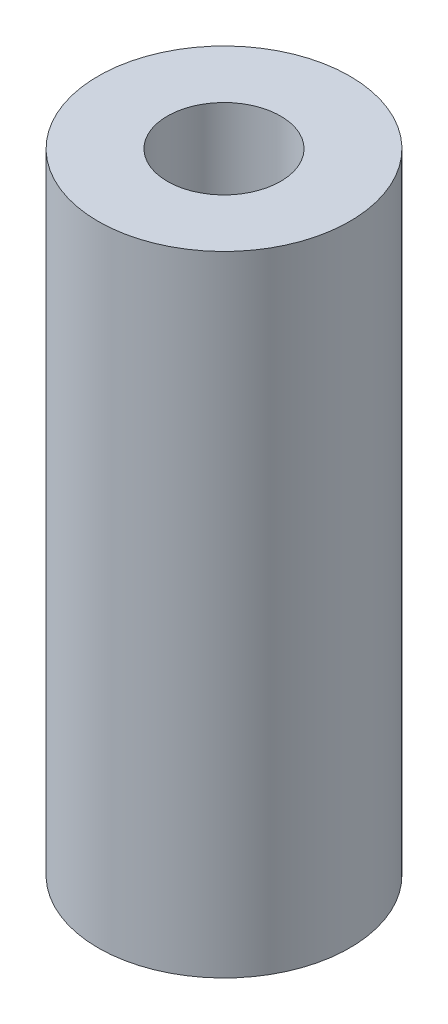
ISO-10303-21;
HEADER;
FILE_DESCRIPTION(('STEP AP214'),'2;1');
FILE_NAME('part.step','',(''),(''),'','','');
FILE_SCHEMA(('AUTOMOTIVE_DESIGN { 1 0 10303 214 1 1 1 1 }'));
ENDSEC;
DATA;
#1=APPLICATION_CONTEXT('core data for automotive mechanical design processes');
#2=APPLICATION_PROTOCOL_DEFINITION('international standard','automotive_design',2000,#1);
#3=PRODUCT_CONTEXT('',#1,'mechanical');
#4=PRODUCT('Part','Part','',(#3));
#5=PRODUCT_RELATED_PRODUCT_CATEGORY('part','',(#4));
#6=PRODUCT_DEFINITION_FORMATION('','',#4);
#7=PRODUCT_DEFINITION_CONTEXT('part definition',#1,'design');
#8=PRODUCT_DEFINITION('design','',#6,#7);
#9=PRODUCT_DEFINITION_SHAPE('','',#8);
#10=(LENGTH_UNIT() NAMED_UNIT(*) SI_UNIT(.MILLI.,.METRE.));
#11=(NAMED_UNIT(*) PLANE_ANGLE_UNIT() SI_UNIT($,.RADIAN.));
#12=(NAMED_UNIT(*) SI_UNIT($,.STERADIAN.) SOLID_ANGLE_UNIT());
#13=UNCERTAINTY_MEASURE_WITH_UNIT(LENGTH_MEASURE(1.E-05),#10,'distance_accuracy_value','');
#14=(GEOMETRIC_REPRESENTATION_CONTEXT(3) GLOBAL_UNCERTAINTY_ASSIGNED_CONTEXT((#13)) GLOBAL_UNIT_ASSIGNED_CONTEXT((#10,
#11,#12)) REPRESENTATION_CONTEXT('',''));
#15=CARTESIAN_POINT('',(0.,0.,0.));
#16=DIRECTION('',(0.,0.,1.));
#17=DIRECTION('',(1.,0.,0.));
#18=AXIS2_PLACEMENT_3D('',#15,#16,#17);
#19=CARTESIAN_POINT('',(0.,20.,0.));
#20=DIRECTION('',(0.,1.,0.));
#21=DIRECTION('',(0.,0.,1.));
#22=AXIS2_PLACEMENT_3D('',#19,#20,#21);
#23=PLANE('',#22);
#24=CARTESIAN_POINT('',(0.,20.,0.));
#25=DIRECTION('',(0.,1.,0.));
#26=DIRECTION('',(0.,0.,1.));
#27=AXIS2_PLACEMENT_3D('',#24,#25,#26);
#28=CIRCLE('',#27,4.);
#29=CARTESIAN_POINT('',(0.,20.,4.));
#30=VERTEX_POINT('',#29);
#31=EDGE_CURVE('E10',#30,#30,#28,.T.);
#32=ORIENTED_EDGE('',*,*,#31,.T.);
#33=EDGE_LOOP('',(#32));
#34=FACE_BOUND('',#33,.T.);
#35=CARTESIAN_POINT('',(0.,20.,0.));
#36=DIRECTION('',(0.,1.,0.));
#37=DIRECTION('',(0.,0.,1.));
#38=AXIS2_PLACEMENT_3D('',#35,#36,#37);
#39=CIRCLE('',#38,1.8);
#40=CARTESIAN_POINT('',(0.,20.,1.8));
#41=VERTEX_POINT('',#40);
#42=EDGE_CURVE('E50',#41,#41,#39,.T.);
#43=ORIENTED_EDGE('',*,*,#42,.F.);
#44=EDGE_LOOP('',(#43));
#45=FACE_BOUND('',#44,.T.);
#46=ADVANCED_FACE('F37',(#34,#45),#23,.T.);
#47=CARTESIAN_POINT('',(0.,0.,0.));
#48=DIRECTION('',(0.,1.,0.));
#49=DIRECTION('',(0.,0.,1.));
#50=AXIS2_PLACEMENT_3D('',#47,#48,#49);
#51=PLANE('',#50);
#52=CARTESIAN_POINT('',(0.,0.,0.));
#53=DIRECTION('',(0.,1.,0.));
#54=DIRECTION('',(0.,0.,1.));
#55=AXIS2_PLACEMENT_3D('',#52,#53,#54);
#56=CIRCLE('',#55,4.);
#57=CARTESIAN_POINT('',(0.,0.,4.));
#58=VERTEX_POINT('',#57);
#59=EDGE_CURVE('E41',#58,#58,#56,.T.);
#60=ORIENTED_EDGE('',*,*,#59,.F.);
#61=EDGE_LOOP('',(#60));
#62=FACE_BOUND('',#61,.T.);
#63=CARTESIAN_POINT('',(0.,0.,0.));
#64=DIRECTION('',(0.,1.,0.));
#65=DIRECTION('',(0.,0.,1.));
#66=AXIS2_PLACEMENT_3D('',#63,#64,#65);
#67=CIRCLE('',#66,1.8);
#68=CARTESIAN_POINT('',(0.,0.,1.8));
#69=VERTEX_POINT('',#68);
#70=EDGE_CURVE('E52',#69,#69,#67,.T.);
#71=ORIENTED_EDGE('',*,*,#70,.T.);
#72=EDGE_LOOP('',(#71));
#73=FACE_BOUND('',#72,.T.);
#74=ADVANCED_FACE('F64',(#62,#73),#51,.F.);
#75=CARTESIAN_POINT('',(0.,20.,0.));
#76=DIRECTION('',(0.,-1.,0.));
#77=DIRECTION('',(0.,0.,-1.));
#78=AXIS2_PLACEMENT_3D('',#75,#76,#77);
#79=CYLINDRICAL_SURFACE('',#78,4.);
#80=ORIENTED_EDGE('',*,*,#31,.F.);
#81=EDGE_LOOP('',(#80));
#82=FACE_BOUND('',#81,.T.);
#83=ORIENTED_EDGE('',*,*,#59,.T.);
#84=EDGE_LOOP('',(#83));
#85=FACE_BOUND('',#84,.T.);
#86=ADVANCED_FACE('F39',(#82,#85),#79,.T.);
#87=CARTESIAN_POINT('',(0.,20.,0.));
#88=DIRECTION('',(0.,-1.,0.));
#89=DIRECTION('',(0.,0.,-1.));
#90=AXIS2_PLACEMENT_3D('',#87,#88,#89);
#91=CYLINDRICAL_SURFACE('',#90,1.8);
#92=ORIENTED_EDGE('',*,*,#42,.T.);
#93=EDGE_LOOP('',(#92));
#94=FACE_BOUND('',#93,.T.);
#95=ORIENTED_EDGE('',*,*,#70,.F.);
#96=EDGE_LOOP('',(#95));
#97=FACE_BOUND('',#96,.T.);
#98=ADVANCED_FACE('F60',(#94,#97),#91,.F.);
#99=CLOSED_SHELL('',(#46,#74,#86,#98));
#100=MANIFOLD_SOLID_BREP('B2',#99);
#101=ADVANCED_BREP_SHAPE_REPRESENTATION('',(#18,#100),#14);
#102=SHAPE_DEFINITION_REPRESENTATION(#9,#101);
ENDSEC;
END-ISO-10303-21;
